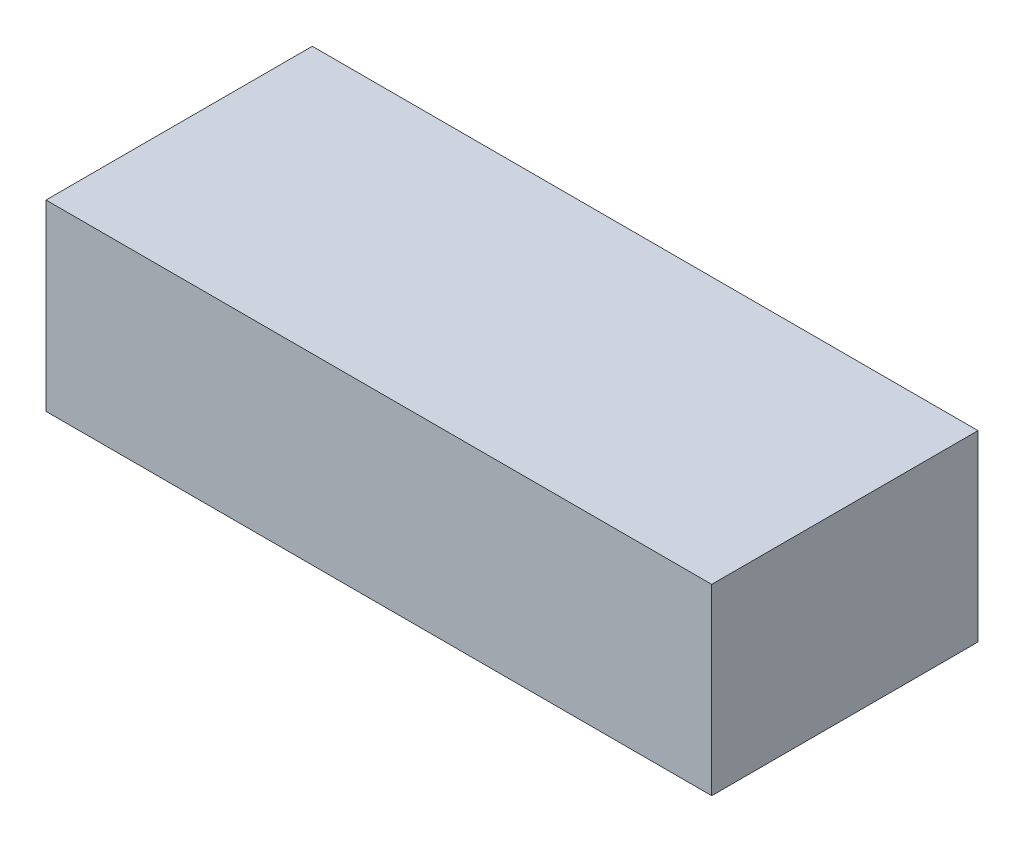
ISO-10303-21;
HEADER;
FILE_DESCRIPTION(('STEP AP214'),'2;1');
FILE_NAME('part.step','',(''),(''),'','','');
FILE_SCHEMA(('AUTOMOTIVE_DESIGN { 1 0 10303 214 1 1 1 1 }'));
ENDSEC;
DATA;
#1=APPLICATION_CONTEXT('core data for automotive mechanical design processes');
#2=APPLICATION_PROTOCOL_DEFINITION('international standard','automotive_design',2000,#1);
#3=PRODUCT_CONTEXT('',#1,'mechanical');
#4=PRODUCT('Part','Part','',(#3));
#5=PRODUCT_RELATED_PRODUCT_CATEGORY('part','',(#4));
#6=PRODUCT_DEFINITION_FORMATION('','',#4);
#7=PRODUCT_DEFINITION_CONTEXT('part definition',#1,'design');
#8=PRODUCT_DEFINITION('design','',#6,#7);
#9=PRODUCT_DEFINITION_SHAPE('','',#8);
#10=(LENGTH_UNIT() NAMED_UNIT(*) SI_UNIT(.MILLI.,.METRE.));
#11=(NAMED_UNIT(*) PLANE_ANGLE_UNIT() SI_UNIT($,.RADIAN.));
#12=(NAMED_UNIT(*) SI_UNIT($,.STERADIAN.) SOLID_ANGLE_UNIT());
#13=UNCERTAINTY_MEASURE_WITH_UNIT(LENGTH_MEASURE(1.E-05),#10,'distance_accuracy_value','');
#14=(GEOMETRIC_REPRESENTATION_CONTEXT(3) GLOBAL_UNCERTAINTY_ASSIGNED_CONTEXT((#13)) GLOBAL_UNIT_ASSIGNED_CONTEXT((#10,
#11,#12)) REPRESENTATION_CONTEXT('',''));
#15=CARTESIAN_POINT('',(0.,0.,0.));
#16=DIRECTION('',(0.,0.,1.));
#17=DIRECTION('',(1.,0.,0.));
#18=AXIS2_PLACEMENT_3D('',#15,#16,#17);
#19=CARTESIAN_POINT('',(0.,0.,10.16));
#20=DIRECTION('',(1.,0.,0.));
#21=DIRECTION('',(0.,1.,0.));
#22=AXIS2_PLACEMENT_3D('',#19,#20,#21);
#23=PLANE('',#22);
#24=DIRECTION('',(0.,-1.,0.));
#25=VECTOR('',#24,1.);
#26=CARTESIAN_POINT('',(0.,0.,0.));
#27=LINE('',#26,#25);
#28=CARTESIAN_POINT('',(0.,0.,0.));
#29=VERTEX_POINT('',#28);
#30=CARTESIAN_POINT('',(0.,-6.985,0.));
#31=VERTEX_POINT('',#30);
#32=EDGE_CURVE('E94',#29,#31,#27,.T.);
#33=ORIENTED_EDGE('',*,*,#32,.T.);
#34=DIRECTION('',(0.,0.,-1.));
#35=VECTOR('',#34,1.);
#36=CARTESIAN_POINT('',(0.,-6.985,10.16));
#37=LINE('',#36,#35);
#38=CARTESIAN_POINT('',(0.,-6.985,10.16));
#39=VERTEX_POINT('',#38);
#40=EDGE_CURVE('E11',#39,#31,#37,.T.);
#41=ORIENTED_EDGE('',*,*,#40,.F.);
#42=DIRECTION('',(0.,-1.,0.));
#43=VECTOR('',#42,1.);
#44=CARTESIAN_POINT('',(0.,0.,10.16));
#45=LINE('',#44,#43);
#46=CARTESIAN_POINT('',(0.,0.,10.16));
#47=VERTEX_POINT('',#46);
#48=EDGE_CURVE('E82',#47,#39,#45,.T.);
#49=ORIENTED_EDGE('',*,*,#48,.F.);
#50=DIRECTION('',(0.,0.,-1.));
#51=VECTOR('',#50,1.);
#52=CARTESIAN_POINT('',(0.,0.,10.16));
#53=LINE('',#52,#51);
#54=EDGE_CURVE('E90',#47,#29,#53,.T.);
#55=ORIENTED_EDGE('',*,*,#54,.T.);
#56=EDGE_LOOP('',(#33,#41,#49,#55));
#57=FACE_BOUND('',#56,.T.);
#58=ADVANCED_FACE('F31',(#57),#23,.F.);
#59=CARTESIAN_POINT('',(0.,-6.985,10.16));
#60=DIRECTION('',(0.,1.,0.));
#61=DIRECTION('',(0.,0.,1.));
#62=AXIS2_PLACEMENT_3D('',#59,#60,#61);
#63=PLANE('',#62);
#64=DIRECTION('',(1.,0.,0.));
#65=VECTOR('',#64,1.);
#66=CARTESIAN_POINT('',(0.,-6.985,0.));
#67=LINE('',#66,#65);
#68=CARTESIAN_POINT('',(25.4,-6.985,0.));
#69=VERTEX_POINT('',#68);
#70=EDGE_CURVE('E86',#31,#69,#67,.T.);
#71=ORIENTED_EDGE('',*,*,#70,.T.);
#72=DIRECTION('',(0.,0.,-1.));
#73=VECTOR('',#72,1.);
#74=CARTESIAN_POINT('',(25.4,-6.985,10.16));
#75=LINE('',#74,#73);
#76=CARTESIAN_POINT('',(25.4,-6.985,10.16));
#77=VERTEX_POINT('',#76);
#78=EDGE_CURVE('E39',#77,#69,#75,.T.);
#79=ORIENTED_EDGE('',*,*,#78,.F.);
#80=DIRECTION('',(1.,0.,0.));
#81=VECTOR('',#80,1.);
#82=CARTESIAN_POINT('',(0.,-6.985,10.16));
#83=LINE('',#82,#81);
#84=EDGE_CURVE('E77',#39,#77,#83,.T.);
#85=ORIENTED_EDGE('',*,*,#84,.F.);
#86=ORIENTED_EDGE('',*,*,#40,.T.);
#87=EDGE_LOOP('',(#71,#79,#85,#86));
#88=FACE_BOUND('',#87,.T.);
#89=ADVANCED_FACE('F85',(#88),#63,.F.);
#90=CARTESIAN_POINT('',(25.4,0.,10.16));
#91=DIRECTION('',(-1.,0.,0.));
#92=DIRECTION('',(0.,0.,1.));
#93=AXIS2_PLACEMENT_3D('',#90,#91,#92);
#94=PLANE('',#93);
#95=DIRECTION('',(0.,1.,0.));
#96=VECTOR('',#95,1.);
#97=CARTESIAN_POINT('',(25.4,0.,0.));
#98=LINE('',#97,#96);
#99=CARTESIAN_POINT('',(25.4,0.,0.));
#100=VERTEX_POINT('',#99);
#101=EDGE_CURVE('E64',#69,#100,#98,.T.);
#102=ORIENTED_EDGE('',*,*,#101,.T.);
#103=DIRECTION('',(0.,0.,-1.));
#104=VECTOR('',#103,1.);
#105=CARTESIAN_POINT('',(25.4,0.,10.16));
#106=LINE('',#105,#104);
#107=CARTESIAN_POINT('',(25.4,0.,10.16));
#108=VERTEX_POINT('',#107);
#109=EDGE_CURVE('E87',#108,#100,#106,.T.);
#110=ORIENTED_EDGE('',*,*,#109,.F.);
#111=DIRECTION('',(0.,1.,0.));
#112=VECTOR('',#111,1.);
#113=CARTESIAN_POINT('',(25.4,0.,10.16));
#114=LINE('',#113,#112);
#115=EDGE_CURVE('E80',#77,#108,#114,.T.);
#116=ORIENTED_EDGE('',*,*,#115,.F.);
#117=ORIENTED_EDGE('',*,*,#78,.T.);
#118=EDGE_LOOP('',(#102,#110,#116,#117));
#119=FACE_BOUND('',#118,.T.);
#120=ADVANCED_FACE('F88',(#119),#94,.F.);
#121=CARTESIAN_POINT('',(0.,0.,10.16));
#122=DIRECTION('',(0.,-1.,0.));
#123=DIRECTION('',(0.,0.,-1.));
#124=AXIS2_PLACEMENT_3D('',#121,#122,#123);
#125=PLANE('',#124);
#126=DIRECTION('',(-1.,0.,0.));
#127=VECTOR('',#126,1.);
#128=CARTESIAN_POINT('',(0.,0.,0.));
#129=LINE('',#128,#127);
#130=EDGE_CURVE('E70',#100,#29,#129,.T.);
#131=ORIENTED_EDGE('',*,*,#130,.T.);
#132=ORIENTED_EDGE('',*,*,#54,.F.);
#133=DIRECTION('',(-1.,0.,0.));
#134=VECTOR('',#133,1.);
#135=CARTESIAN_POINT('',(0.,0.,10.16));
#136=LINE('',#135,#134);
#137=EDGE_CURVE('E47',#108,#47,#136,.T.);
#138=ORIENTED_EDGE('',*,*,#137,.F.);
#139=ORIENTED_EDGE('',*,*,#109,.T.);
#140=EDGE_LOOP('',(#131,#132,#138,#139));
#141=FACE_BOUND('',#140,.T.);
#142=ADVANCED_FACE('F101',(#141),#125,.F.);
#143=CARTESIAN_POINT('',(0.,-6.985,10.16));
#144=DIRECTION('',(0.,0.,1.));
#145=DIRECTION('',(1.,0.,0.));
#146=AXIS2_PLACEMENT_3D('',#143,#144,#145);
#147=PLANE('',#146);
#148=ORIENTED_EDGE('',*,*,#48,.T.);
#149=ORIENTED_EDGE('',*,*,#84,.T.);
#150=ORIENTED_EDGE('',*,*,#115,.T.);
#151=ORIENTED_EDGE('',*,*,#137,.T.);
#152=EDGE_LOOP('',(#148,#149,#150,#151));
#153=FACE_BOUND('',#152,.T.);
#154=ADVANCED_FACE('F78',(#153),#147,.T.);
#155=CARTESIAN_POINT('',(0.,-6.985,0.));
#156=DIRECTION('',(0.,0.,1.));
#157=DIRECTION('',(1.,0.,0.));
#158=AXIS2_PLACEMENT_3D('',#155,#156,#157);
#159=PLANE('',#158);
#160=ORIENTED_EDGE('',*,*,#32,.F.);
#161=ORIENTED_EDGE('',*,*,#130,.F.);
#162=ORIENTED_EDGE('',*,*,#101,.F.);
#163=ORIENTED_EDGE('',*,*,#70,.F.);
#164=EDGE_LOOP('',(#160,#161,#162,#163));
#165=FACE_BOUND('',#164,.T.);
#166=ADVANCED_FACE('F104',(#165),#159,.F.);
#167=CLOSED_SHELL('',(#58,#89,#120,#142,#154,#166));
#168=MANIFOLD_SOLID_BREP('B2',#167);
#169=ADVANCED_BREP_SHAPE_REPRESENTATION('',(#18,#168),#14);
#170=SHAPE_DEFINITION_REPRESENTATION(#9,#169);
ENDSEC;
END-ISO-10303-21;
